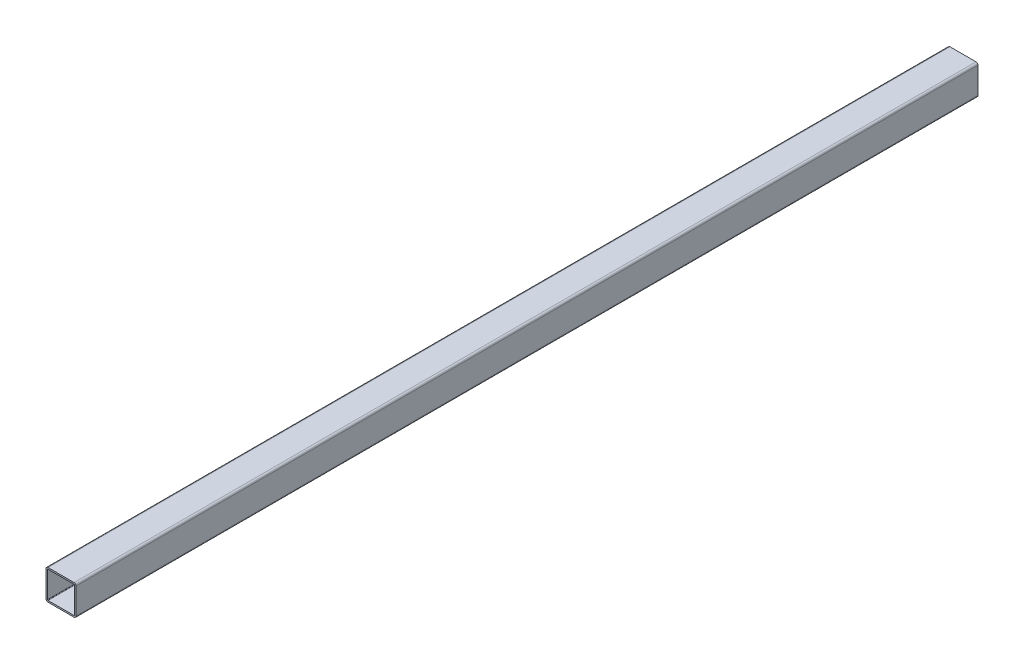
ISO-10303-21;
HEADER;
FILE_DESCRIPTION(('STEP AP214'),'2;1');
FILE_NAME('part.step','',(''),(''),'','','');
FILE_SCHEMA(('AUTOMOTIVE_DESIGN { 1 0 10303 214 1 1 1 1 }'));
ENDSEC;
DATA;
#1=APPLICATION_CONTEXT('core data for automotive mechanical design processes');
#2=APPLICATION_PROTOCOL_DEFINITION('international standard','automotive_design',2000,#1);
#3=PRODUCT_CONTEXT('',#1,'mechanical');
#4=PRODUCT('Part','Part','',(#3));
#5=PRODUCT_RELATED_PRODUCT_CATEGORY('part','',(#4));
#6=PRODUCT_DEFINITION_FORMATION('','',#4);
#7=PRODUCT_DEFINITION_CONTEXT('part definition',#1,'design');
#8=PRODUCT_DEFINITION('design','',#6,#7);
#9=PRODUCT_DEFINITION_SHAPE('','',#8);
#10=(LENGTH_UNIT() NAMED_UNIT(*) SI_UNIT(.MILLI.,.METRE.));
#11=(NAMED_UNIT(*) PLANE_ANGLE_UNIT() SI_UNIT($,.RADIAN.));
#12=(NAMED_UNIT(*) SI_UNIT($,.STERADIAN.) SOLID_ANGLE_UNIT());
#13=UNCERTAINTY_MEASURE_WITH_UNIT(LENGTH_MEASURE(1.E-05),#10,'distance_accuracy_value','');
#14=(GEOMETRIC_REPRESENTATION_CONTEXT(3) GLOBAL_UNCERTAINTY_ASSIGNED_CONTEXT((#13)) GLOBAL_UNIT_ASSIGNED_CONTEXT((#10,
#11,#12)) REPRESENTATION_CONTEXT('',''));
#15=CARTESIAN_POINT('',(0.,0.,0.));
#16=DIRECTION('',(0.,0.,1.));
#17=DIRECTION('',(1.,0.,0.));
#18=AXIS2_PLACEMENT_3D('',#15,#16,#17);
#19=CARTESIAN_POINT('',(2.,2.,900.));
#20=DIRECTION('',(0.,0.,1.));
#21=DIRECTION('',(1.,0.,0.));
#22=AXIS2_PLACEMENT_3D('',#19,#20,#21);
#23=PLANE('',#22);
#24=CARTESIAN_POINT('',(2.,2.,900.));
#25=DIRECTION('',(0.,0.,1.));
#26=DIRECTION('',(1.,0.,0.));
#27=AXIS2_PLACEMENT_3D('',#24,#25,#26);
#28=CIRCLE('',#27,2.);
#29=CARTESIAN_POINT('',(0.,2.00000000000001,900.));
#30=VERTEX_POINT('',#29);
#31=CARTESIAN_POINT('',(2.00000000000001,0.,900.));
#32=VERTEX_POINT('',#31);
#33=EDGE_CURVE('E260',#30,#32,#28,.T.);
#34=ORIENTED_EDGE('',*,*,#33,.T.);
#35=DIRECTION('',(1.,0.,0.));
#36=VECTOR('',#35,1.);
#37=CARTESIAN_POINT('',(2.00000000000001,0.,900.));
#38=LINE('',#37,#36);
#39=CARTESIAN_POINT('',(28.,0.,900.));
#40=VERTEX_POINT('',#39);
#41=EDGE_CURVE('E263',#32,#40,#38,.T.);
#42=ORIENTED_EDGE('',*,*,#41,.T.);
#43=CARTESIAN_POINT('',(28.,2.,900.));
#44=DIRECTION('',(0.,0.,1.));
#45=DIRECTION('',(-1.,0.,0.));
#46=AXIS2_PLACEMENT_3D('',#43,#44,#45);
#47=CIRCLE('',#46,2.);
#48=CARTESIAN_POINT('',(30.,2.00000000000001,900.));
#49=VERTEX_POINT('',#48);
#50=EDGE_CURVE('E266',#40,#49,#47,.T.);
#51=ORIENTED_EDGE('',*,*,#50,.T.);
#52=DIRECTION('',(0.,1.,0.));
#53=VECTOR('',#52,1.);
#54=CARTESIAN_POINT('',(30.,2.00000000000001,900.));
#55=LINE('',#54,#53);
#56=CARTESIAN_POINT('',(30.,28.,900.));
#57=VERTEX_POINT('',#56);
#58=EDGE_CURVE('E268',#49,#57,#55,.T.);
#59=ORIENTED_EDGE('',*,*,#58,.T.);
#60=CARTESIAN_POINT('',(28.,28.,900.));
#61=DIRECTION('',(0.,0.,1.));
#62=DIRECTION('',(-1.,0.,0.));
#63=AXIS2_PLACEMENT_3D('',#60,#61,#62);
#64=CIRCLE('',#63,2.);
#65=CARTESIAN_POINT('',(28.,30.,900.));
#66=VERTEX_POINT('',#65);
#67=EDGE_CURVE('E270',#57,#66,#64,.T.);
#68=ORIENTED_EDGE('',*,*,#67,.T.);
#69=DIRECTION('',(-1.,0.,0.));
#70=VECTOR('',#69,1.);
#71=CARTESIAN_POINT('',(2.00000000000001,30.,900.));
#72=LINE('',#71,#70);
#73=CARTESIAN_POINT('',(2.00000000000001,30.,900.));
#74=VERTEX_POINT('',#73);
#75=EDGE_CURVE('E272',#66,#74,#72,.T.);
#76=ORIENTED_EDGE('',*,*,#75,.T.);
#77=CARTESIAN_POINT('',(2.,28.,900.));
#78=DIRECTION('',(0.,0.,1.));
#79=DIRECTION('',(1.,0.,0.));
#80=AXIS2_PLACEMENT_3D('',#77,#78,#79);
#81=CIRCLE('',#80,2.);
#82=CARTESIAN_POINT('',(0.,28.,900.));
#83=VERTEX_POINT('',#82);
#84=EDGE_CURVE('E274',#74,#83,#81,.T.);
#85=ORIENTED_EDGE('',*,*,#84,.T.);
#86=DIRECTION('',(0.,-1.,0.));
#87=VECTOR('',#86,1.);
#88=CARTESIAN_POINT('',(0.,2.00000000000001,900.));
#89=LINE('',#88,#87);
#90=EDGE_CURVE('E276',#83,#30,#89,.T.);
#91=ORIENTED_EDGE('',*,*,#90,.T.);
#92=EDGE_LOOP('',(#34,#42,#51,#59,#68,#76,#85,#91));
#93=FACE_BOUND('',#92,.T.);
#94=DIRECTION('',(1.,0.,0.));
#95=VECTOR('',#94,1.);
#96=CARTESIAN_POINT('',(2.00000000000001,1.5,900.));
#97=LINE('',#96,#95);
#98=CARTESIAN_POINT('',(2.00000000000001,1.5,900.));
#99=VERTEX_POINT('',#98);
#100=CARTESIAN_POINT('',(28.,1.5,900.));
#101=VERTEX_POINT('',#100);
#102=EDGE_CURVE('E203',#99,#101,#97,.T.);
#103=ORIENTED_EDGE('',*,*,#102,.F.);
#104=CARTESIAN_POINT('',(2.,2.,900.));
#105=DIRECTION('',(0.,0.,1.));
#106=DIRECTION('',(1.,0.,0.));
#107=AXIS2_PLACEMENT_3D('',#104,#105,#106);
#108=CIRCLE('',#107,0.5);
#109=CARTESIAN_POINT('',(1.5,2.00000000000001,900.));
#110=VERTEX_POINT('',#109);
#111=EDGE_CURVE('E195',#110,#99,#108,.T.);
#112=ORIENTED_EDGE('',*,*,#111,.F.);
#113=DIRECTION('',(0.,-1.,0.));
#114=VECTOR('',#113,1.);
#115=CARTESIAN_POINT('',(1.5,2.00000000000001,900.));
#116=LINE('',#115,#114);
#117=CARTESIAN_POINT('',(1.5,28.,900.));
#118=VERTEX_POINT('',#117);
#119=EDGE_CURVE('E228',#118,#110,#116,.T.);
#120=ORIENTED_EDGE('',*,*,#119,.F.);
#121=CARTESIAN_POINT('',(2.,28.,900.));
#122=DIRECTION('',(0.,0.,1.));
#123=DIRECTION('',(1.,0.,0.));
#124=AXIS2_PLACEMENT_3D('',#121,#122,#123);
#125=CIRCLE('',#124,0.500000000000001);
#126=CARTESIAN_POINT('',(2.00000000000001,28.5,900.));
#127=VERTEX_POINT('',#126);
#128=EDGE_CURVE('E226',#127,#118,#125,.T.);
#129=ORIENTED_EDGE('',*,*,#128,.F.);
#130=DIRECTION('',(-1.,0.,0.));
#131=VECTOR('',#130,1.);
#132=CARTESIAN_POINT('',(2.00000000000001,28.5,900.));
#133=LINE('',#132,#131);
#134=CARTESIAN_POINT('',(28.,28.5,900.));
#135=VERTEX_POINT('',#134);
#136=EDGE_CURVE('E224',#135,#127,#133,.T.);
#137=ORIENTED_EDGE('',*,*,#136,.F.);
#138=CARTESIAN_POINT('',(28.,28.,900.));
#139=DIRECTION('',(0.,0.,1.));
#140=DIRECTION('',(1.,0.,0.));
#141=AXIS2_PLACEMENT_3D('',#138,#139,#140);
#142=CIRCLE('',#141,0.500000000000002);
#143=CARTESIAN_POINT('',(28.5,28.,900.));
#144=VERTEX_POINT('',#143);
#145=EDGE_CURVE('E222',#144,#135,#142,.T.);
#146=ORIENTED_EDGE('',*,*,#145,.F.);
#147=DIRECTION('',(0.,1.,0.));
#148=VECTOR('',#147,1.);
#149=CARTESIAN_POINT('',(28.5,2.00000000000001,900.));
#150=LINE('',#149,#148);
#151=CARTESIAN_POINT('',(28.5,2.,900.));
#152=VERTEX_POINT('',#151);
#153=EDGE_CURVE('E218',#152,#144,#150,.T.);
#154=ORIENTED_EDGE('',*,*,#153,.F.);
#155=CARTESIAN_POINT('',(28.,2.,900.));
#156=DIRECTION('',(0.,0.,1.));
#157=DIRECTION('',(1.,0.,0.));
#158=AXIS2_PLACEMENT_3D('',#155,#156,#157);
#159=CIRCLE('',#158,0.500000000000001);
#160=EDGE_CURVE('E216',#101,#152,#159,.T.);
#161=ORIENTED_EDGE('',*,*,#160,.F.);
#162=EDGE_LOOP('',(#103,#112,#120,#129,#137,#146,#154,#161));
#163=FACE_BOUND('',#162,.T.);
#164=ADVANCED_FACE('F82',(#93,#163),#23,.T.);
#165=CARTESIAN_POINT('',(2.,2.,0.));
#166=DIRECTION('',(0.,0.,1.));
#167=DIRECTION('',(1.,0.,0.));
#168=AXIS2_PLACEMENT_3D('',#165,#166,#167);
#169=PLANE('',#168);
#170=CARTESIAN_POINT('',(2.,2.,0.));
#171=DIRECTION('',(0.,0.,1.));
#172=DIRECTION('',(1.,0.,0.));
#173=AXIS2_PLACEMENT_3D('',#170,#171,#172);
#174=CIRCLE('',#173,2.);
#175=CARTESIAN_POINT('',(0.,2.00000000000001,0.));
#176=VERTEX_POINT('',#175);
#177=CARTESIAN_POINT('',(2.00000000000001,0.,0.));
#178=VERTEX_POINT('',#177);
#179=EDGE_CURVE('E211',#176,#178,#174,.T.);
#180=ORIENTED_EDGE('',*,*,#179,.F.);
#181=DIRECTION('',(0.,-1.,0.));
#182=VECTOR('',#181,1.);
#183=CARTESIAN_POINT('',(0.,2.00000000000001,0.));
#184=LINE('',#183,#182);
#185=CARTESIAN_POINT('',(0.,28.,0.));
#186=VERTEX_POINT('',#185);
#187=EDGE_CURVE('E264',#186,#176,#184,.T.);
#188=ORIENTED_EDGE('',*,*,#187,.F.);
#189=CARTESIAN_POINT('',(2.,28.,0.));
#190=DIRECTION('',(0.,0.,1.));
#191=DIRECTION('',(1.,0.,0.));
#192=AXIS2_PLACEMENT_3D('',#189,#190,#191);
#193=CIRCLE('',#192,2.);
#194=CARTESIAN_POINT('',(2.00000000000001,30.,0.));
#195=VERTEX_POINT('',#194);
#196=EDGE_CURVE('E291',#195,#186,#193,.T.);
#197=ORIENTED_EDGE('',*,*,#196,.F.);
#198=DIRECTION('',(-1.,0.,0.));
#199=VECTOR('',#198,1.);
#200=CARTESIAN_POINT('',(2.00000000000001,30.,0.));
#201=LINE('',#200,#199);
#202=CARTESIAN_POINT('',(28.,30.,0.));
#203=VERTEX_POINT('',#202);
#204=EDGE_CURVE('E289',#203,#195,#201,.T.);
#205=ORIENTED_EDGE('',*,*,#204,.F.);
#206=CARTESIAN_POINT('',(28.,28.,0.));
#207=DIRECTION('',(0.,0.,1.));
#208=DIRECTION('',(-1.,0.,0.));
#209=AXIS2_PLACEMENT_3D('',#206,#207,#208);
#210=CIRCLE('',#209,2.);
#211=CARTESIAN_POINT('',(30.,28.,0.));
#212=VERTEX_POINT('',#211);
#213=EDGE_CURVE('E287',#212,#203,#210,.T.);
#214=ORIENTED_EDGE('',*,*,#213,.F.);
#215=DIRECTION('',(0.,1.,0.));
#216=VECTOR('',#215,1.);
#217=CARTESIAN_POINT('',(30.,2.00000000000001,0.));
#218=LINE('',#217,#216);
#219=CARTESIAN_POINT('',(30.,2.00000000000001,0.));
#220=VERTEX_POINT('',#219);
#221=EDGE_CURVE('E285',#220,#212,#218,.T.);
#222=ORIENTED_EDGE('',*,*,#221,.F.);
#223=CARTESIAN_POINT('',(28.,2.,0.));
#224=DIRECTION('',(0.,0.,1.));
#225=DIRECTION('',(-1.,0.,0.));
#226=AXIS2_PLACEMENT_3D('',#223,#224,#225);
#227=CIRCLE('',#226,2.);
#228=CARTESIAN_POINT('',(28.,0.,0.));
#229=VERTEX_POINT('',#228);
#230=EDGE_CURVE('E283',#229,#220,#227,.T.);
#231=ORIENTED_EDGE('',*,*,#230,.F.);
#232=DIRECTION('',(1.,0.,0.));
#233=VECTOR('',#232,1.);
#234=CARTESIAN_POINT('',(2.00000000000001,0.,0.));
#235=LINE('',#234,#233);
#236=EDGE_CURVE('E281',#178,#229,#235,.T.);
#237=ORIENTED_EDGE('',*,*,#236,.F.);
#238=EDGE_LOOP('',(#180,#188,#197,#205,#214,#222,#231,#237));
#239=FACE_BOUND('',#238,.T.);
#240=CARTESIAN_POINT('',(2.,2.,0.));
#241=DIRECTION('',(0.,0.,1.));
#242=DIRECTION('',(1.,0.,0.));
#243=AXIS2_PLACEMENT_3D('',#240,#241,#242);
#244=CIRCLE('',#243,0.5);
#245=CARTESIAN_POINT('',(1.5,2.00000000000001,0.));
#246=VERTEX_POINT('',#245);
#247=CARTESIAN_POINT('',(2.00000000000001,1.5,0.));
#248=VERTEX_POINT('',#247);
#249=EDGE_CURVE('E105',#246,#248,#244,.T.);
#250=ORIENTED_EDGE('',*,*,#249,.T.);
#251=DIRECTION('',(1.,0.,0.));
#252=VECTOR('',#251,1.);
#253=CARTESIAN_POINT('',(2.00000000000001,1.5,0.));
#254=LINE('',#253,#252);
#255=CARTESIAN_POINT('',(28.,1.5,0.));
#256=VERTEX_POINT('',#255);
#257=EDGE_CURVE('E210',#248,#256,#254,.T.);
#258=ORIENTED_EDGE('',*,*,#257,.T.);
#259=CARTESIAN_POINT('',(28.,2.,0.));
#260=DIRECTION('',(0.,0.,1.));
#261=DIRECTION('',(1.,0.,0.));
#262=AXIS2_PLACEMENT_3D('',#259,#260,#261);
#263=CIRCLE('',#262,0.500000000000001);
#264=CARTESIAN_POINT('',(28.5,2.,0.));
#265=VERTEX_POINT('',#264);
#266=EDGE_CURVE('E232',#256,#265,#263,.T.);
#267=ORIENTED_EDGE('',*,*,#266,.T.);
#268=DIRECTION('',(0.,1.,0.));
#269=VECTOR('',#268,1.);
#270=CARTESIAN_POINT('',(28.5,2.00000000000001,0.));
#271=LINE('',#270,#269);
#272=CARTESIAN_POINT('',(28.5,28.,0.));
#273=VERTEX_POINT('',#272);
#274=EDGE_CURVE('E235',#265,#273,#271,.T.);
#275=ORIENTED_EDGE('',*,*,#274,.T.);
#276=CARTESIAN_POINT('',(28.,28.,0.));
#277=DIRECTION('',(0.,0.,1.));
#278=DIRECTION('',(1.,0.,0.));
#279=AXIS2_PLACEMENT_3D('',#276,#277,#278);
#280=CIRCLE('',#279,0.500000000000002);
#281=CARTESIAN_POINT('',(28.,28.5,0.));
#282=VERTEX_POINT('',#281);
#283=EDGE_CURVE('E238',#273,#282,#280,.T.);
#284=ORIENTED_EDGE('',*,*,#283,.T.);
#285=DIRECTION('',(-1.,0.,0.));
#286=VECTOR('',#285,1.);
#287=CARTESIAN_POINT('',(2.00000000000001,28.5,0.));
#288=LINE('',#287,#286);
#289=CARTESIAN_POINT('',(2.00000000000001,28.5,0.));
#290=VERTEX_POINT('',#289);
#291=EDGE_CURVE('E241',#282,#290,#288,.T.);
#292=ORIENTED_EDGE('',*,*,#291,.T.);
#293=CARTESIAN_POINT('',(2.,28.,0.));
#294=DIRECTION('',(0.,0.,1.));
#295=DIRECTION('',(1.,0.,0.));
#296=AXIS2_PLACEMENT_3D('',#293,#294,#295);
#297=CIRCLE('',#296,0.500000000000001);
#298=CARTESIAN_POINT('',(1.5,28.,0.));
#299=VERTEX_POINT('',#298);
#300=EDGE_CURVE('E244',#290,#299,#297,.T.);
#301=ORIENTED_EDGE('',*,*,#300,.T.);
#302=DIRECTION('',(0.,-1.,0.));
#303=VECTOR('',#302,1.);
#304=CARTESIAN_POINT('',(1.5,2.00000000000001,0.));
#305=LINE('',#304,#303);
#306=EDGE_CURVE('E204',#299,#246,#305,.T.);
#307=ORIENTED_EDGE('',*,*,#306,.T.);
#308=EDGE_LOOP('',(#250,#258,#267,#275,#284,#292,#301,#307));
#309=FACE_BOUND('',#308,.T.);
#310=ADVANCED_FACE('F321',(#239,#309),#169,.F.);
#311=CARTESIAN_POINT('',(2.,2.,900.));
#312=DIRECTION('',(0.,0.,-1.));
#313=DIRECTION('',(-1.,0.,0.));
#314=AXIS2_PLACEMENT_3D('',#311,#312,#313);
#315=CYLINDRICAL_SURFACE('',#314,2.);
#316=ORIENTED_EDGE('',*,*,#179,.T.);
#317=DIRECTION('',(0.,0.,-1.));
#318=VECTOR('',#317,1.);
#319=CARTESIAN_POINT('',(2.00000000000001,0.,900.));
#320=LINE('',#319,#318);
#321=EDGE_CURVE('E12',#32,#178,#320,.T.);
#322=ORIENTED_EDGE('',*,*,#321,.F.);
#323=ORIENTED_EDGE('',*,*,#33,.F.);
#324=DIRECTION('',(0.,0.,-1.));
#325=VECTOR('',#324,1.);
#326=CARTESIAN_POINT('',(0.,2.00000000000001,900.));
#327=LINE('',#326,#325);
#328=EDGE_CURVE('E278',#30,#176,#327,.T.);
#329=ORIENTED_EDGE('',*,*,#328,.T.);
#330=EDGE_LOOP('',(#316,#322,#323,#329));
#331=FACE_BOUND('',#330,.T.);
#332=ADVANCED_FACE('F84',(#331),#315,.T.);
#333=CARTESIAN_POINT('',(2.00000000000001,0.,900.));
#334=DIRECTION('',(0.,1.,0.));
#335=DIRECTION('',(0.,0.,1.));
#336=AXIS2_PLACEMENT_3D('',#333,#334,#335);
#337=PLANE('',#336);
#338=ORIENTED_EDGE('',*,*,#236,.T.);
#339=DIRECTION('',(0.,0.,-1.));
#340=VECTOR('',#339,1.);
#341=CARTESIAN_POINT('',(28.,0.,900.));
#342=LINE('',#341,#340);
#343=EDGE_CURVE('E90',#40,#229,#342,.T.);
#344=ORIENTED_EDGE('',*,*,#343,.F.);
#345=ORIENTED_EDGE('',*,*,#41,.F.);
#346=ORIENTED_EDGE('',*,*,#321,.T.);
#347=EDGE_LOOP('',(#338,#344,#345,#346));
#348=FACE_BOUND('',#347,.T.);
#349=ADVANCED_FACE('F338',(#348),#337,.F.);
#350=CARTESIAN_POINT('',(28.,2.,900.));
#351=DIRECTION('',(0.,0.,-1.));
#352=DIRECTION('',(-1.,0.,0.));
#353=AXIS2_PLACEMENT_3D('',#350,#351,#352);
#354=CYLINDRICAL_SURFACE('',#353,2.);
#355=ORIENTED_EDGE('',*,*,#230,.T.);
#356=DIRECTION('',(0.,0.,-1.));
#357=VECTOR('',#356,1.);
#358=CARTESIAN_POINT('',(30.,2.00000000000001,900.));
#359=LINE('',#358,#357);
#360=EDGE_CURVE('E308',#49,#220,#359,.T.);
#361=ORIENTED_EDGE('',*,*,#360,.F.);
#362=ORIENTED_EDGE('',*,*,#50,.F.);
#363=ORIENTED_EDGE('',*,*,#343,.T.);
#364=EDGE_LOOP('',(#355,#361,#362,#363));
#365=FACE_BOUND('',#364,.T.);
#366=ADVANCED_FACE('F315',(#365),#354,.T.);
#367=CARTESIAN_POINT('',(30.,2.00000000000001,900.));
#368=DIRECTION('',(-1.,0.,0.));
#369=DIRECTION('',(0.,0.,1.));
#370=AXIS2_PLACEMENT_3D('',#367,#368,#369);
#371=PLANE('',#370);
#372=ORIENTED_EDGE('',*,*,#221,.T.);
#373=DIRECTION('',(0.,0.,-1.));
#374=VECTOR('',#373,1.);
#375=CARTESIAN_POINT('',(30.,28.,900.));
#376=LINE('',#375,#374);
#377=EDGE_CURVE('E305',#57,#212,#376,.T.);
#378=ORIENTED_EDGE('',*,*,#377,.F.);
#379=ORIENTED_EDGE('',*,*,#58,.F.);
#380=ORIENTED_EDGE('',*,*,#360,.T.);
#381=EDGE_LOOP('',(#372,#378,#379,#380));
#382=FACE_BOUND('',#381,.T.);
#383=ADVANCED_FACE('F327',(#382),#371,.F.);
#384=CARTESIAN_POINT('',(28.,28.,900.));
#385=DIRECTION('',(0.,0.,-1.));
#386=DIRECTION('',(-1.,0.,0.));
#387=AXIS2_PLACEMENT_3D('',#384,#385,#386);
#388=CYLINDRICAL_SURFACE('',#387,2.);
#389=ORIENTED_EDGE('',*,*,#213,.T.);
#390=DIRECTION('',(0.,0.,-1.));
#391=VECTOR('',#390,1.);
#392=CARTESIAN_POINT('',(28.,30.,900.));
#393=LINE('',#392,#391);
#394=EDGE_CURVE('E302',#66,#203,#393,.T.);
#395=ORIENTED_EDGE('',*,*,#394,.F.);
#396=ORIENTED_EDGE('',*,*,#67,.F.);
#397=ORIENTED_EDGE('',*,*,#377,.T.);
#398=EDGE_LOOP('',(#389,#395,#396,#397));
#399=FACE_BOUND('',#398,.T.);
#400=ADVANCED_FACE('F331',(#399),#388,.T.);
#401=CARTESIAN_POINT('',(2.00000000000001,30.,900.));
#402=DIRECTION('',(0.,-1.,0.));
#403=DIRECTION('',(0.,0.,-1.));
#404=AXIS2_PLACEMENT_3D('',#401,#402,#403);
#405=PLANE('',#404);
#406=ORIENTED_EDGE('',*,*,#204,.T.);
#407=DIRECTION('',(0.,0.,-1.));
#408=VECTOR('',#407,1.);
#409=CARTESIAN_POINT('',(2.00000000000001,30.,900.));
#410=LINE('',#409,#408);
#411=EDGE_CURVE('E299',#74,#195,#410,.T.);
#412=ORIENTED_EDGE('',*,*,#411,.F.);
#413=ORIENTED_EDGE('',*,*,#75,.F.);
#414=ORIENTED_EDGE('',*,*,#394,.T.);
#415=EDGE_LOOP('',(#406,#412,#413,#414));
#416=FACE_BOUND('',#415,.T.);
#417=ADVANCED_FACE('F351',(#416),#405,.F.);
#418=CARTESIAN_POINT('',(2.,28.,900.));
#419=DIRECTION('',(0.,0.,-1.));
#420=DIRECTION('',(-1.,0.,0.));
#421=AXIS2_PLACEMENT_3D('',#418,#419,#420);
#422=CYLINDRICAL_SURFACE('',#421,2.);
#423=ORIENTED_EDGE('',*,*,#196,.T.);
#424=DIRECTION('',(0.,0.,-1.));
#425=VECTOR('',#424,1.);
#426=CARTESIAN_POINT('',(0.,28.,900.));
#427=LINE('',#426,#425);
#428=EDGE_CURVE('E296',#83,#186,#427,.T.);
#429=ORIENTED_EDGE('',*,*,#428,.F.);
#430=ORIENTED_EDGE('',*,*,#84,.F.);
#431=ORIENTED_EDGE('',*,*,#411,.T.);
#432=EDGE_LOOP('',(#423,#429,#430,#431));
#433=FACE_BOUND('',#432,.T.);
#434=ADVANCED_FACE('F349',(#433),#422,.T.);
#435=CARTESIAN_POINT('',(0.,2.00000000000001,900.));
#436=DIRECTION('',(1.,0.,0.));
#437=DIRECTION('',(0.,0.,-1.));
#438=AXIS2_PLACEMENT_3D('',#435,#436,#437);
#439=PLANE('',#438);
#440=ORIENTED_EDGE('',*,*,#187,.T.);
#441=ORIENTED_EDGE('',*,*,#328,.F.);
#442=ORIENTED_EDGE('',*,*,#90,.F.);
#443=ORIENTED_EDGE('',*,*,#428,.T.);
#444=EDGE_LOOP('',(#440,#441,#442,#443));
#445=FACE_BOUND('',#444,.T.);
#446=ADVANCED_FACE('F344',(#445),#439,.F.);
#447=CARTESIAN_POINT('',(2.,2.,900.));
#448=DIRECTION('',(0.,0.,-1.));
#449=DIRECTION('',(-1.,0.,0.));
#450=AXIS2_PLACEMENT_3D('',#447,#448,#449);
#451=CYLINDRICAL_SURFACE('',#450,0.5);
#452=ORIENTED_EDGE('',*,*,#249,.F.);
#453=DIRECTION('',(0.,0.,-1.));
#454=VECTOR('',#453,1.);
#455=CARTESIAN_POINT('',(1.5,2.00000000000001,900.));
#456=LINE('',#455,#454);
#457=EDGE_CURVE('E199',#110,#246,#456,.T.);
#458=ORIENTED_EDGE('',*,*,#457,.F.);
#459=ORIENTED_EDGE('',*,*,#111,.T.);
#460=DIRECTION('',(0.,0.,-1.));
#461=VECTOR('',#460,1.);
#462=CARTESIAN_POINT('',(2.00000000000001,1.5,900.));
#463=LINE('',#462,#461);
#464=EDGE_CURVE('E198',#99,#248,#463,.T.);
#465=ORIENTED_EDGE('',*,*,#464,.T.);
#466=EDGE_LOOP('',(#452,#458,#459,#465));
#467=FACE_BOUND('',#466,.T.);
#468=ADVANCED_FACE('F197',(#467),#451,.F.);
#469=CARTESIAN_POINT('',(2.00000000000001,1.5,900.));
#470=DIRECTION('',(0.,1.,0.));
#471=DIRECTION('',(0.,0.,1.));
#472=AXIS2_PLACEMENT_3D('',#469,#470,#471);
#473=PLANE('',#472);
#474=ORIENTED_EDGE('',*,*,#257,.F.);
#475=ORIENTED_EDGE('',*,*,#464,.F.);
#476=ORIENTED_EDGE('',*,*,#102,.T.);
#477=DIRECTION('',(0.,0.,-1.));
#478=VECTOR('',#477,1.);
#479=CARTESIAN_POINT('',(28.,1.5,900.));
#480=LINE('',#479,#478);
#481=EDGE_CURVE('E212',#101,#256,#480,.T.);
#482=ORIENTED_EDGE('',*,*,#481,.T.);
#483=EDGE_LOOP('',(#474,#475,#476,#482));
#484=FACE_BOUND('',#483,.T.);
#485=ADVANCED_FACE('F207',(#484),#473,.T.);
#486=CARTESIAN_POINT('',(28.,2.,900.));
#487=DIRECTION('',(0.,0.,-1.));
#488=DIRECTION('',(-1.,0.,0.));
#489=AXIS2_PLACEMENT_3D('',#486,#487,#488);
#490=CYLINDRICAL_SURFACE('',#489,0.500000000000001);
#491=ORIENTED_EDGE('',*,*,#266,.F.);
#492=ORIENTED_EDGE('',*,*,#481,.F.);
#493=ORIENTED_EDGE('',*,*,#160,.T.);
#494=DIRECTION('',(0.,0.,-1.));
#495=VECTOR('',#494,1.);
#496=CARTESIAN_POINT('',(28.5,2.,900.));
#497=LINE('',#496,#495);
#498=EDGE_CURVE('E257',#152,#265,#497,.T.);
#499=ORIENTED_EDGE('',*,*,#498,.T.);
#500=EDGE_LOOP('',(#491,#492,#493,#499));
#501=FACE_BOUND('',#500,.T.);
#502=ADVANCED_FACE('F376',(#501),#490,.F.);
#503=CARTESIAN_POINT('',(28.5,2.00000000000001,900.));
#504=DIRECTION('',(-1.,0.,0.));
#505=DIRECTION('',(0.,0.,1.));
#506=AXIS2_PLACEMENT_3D('',#503,#504,#505);
#507=PLANE('',#506);
#508=ORIENTED_EDGE('',*,*,#274,.F.);
#509=ORIENTED_EDGE('',*,*,#498,.F.);
#510=ORIENTED_EDGE('',*,*,#153,.T.);
#511=DIRECTION('',(0.,0.,-1.));
#512=VECTOR('',#511,1.);
#513=CARTESIAN_POINT('',(28.5,28.,900.));
#514=LINE('',#513,#512);
#515=EDGE_CURVE('E255',#144,#273,#514,.T.);
#516=ORIENTED_EDGE('',*,*,#515,.T.);
#517=EDGE_LOOP('',(#508,#509,#510,#516));
#518=FACE_BOUND('',#517,.T.);
#519=ADVANCED_FACE('F380',(#518),#507,.T.);
#520=CARTESIAN_POINT('',(28.,28.,900.));
#521=DIRECTION('',(0.,0.,-1.));
#522=DIRECTION('',(-1.,0.,0.));
#523=AXIS2_PLACEMENT_3D('',#520,#521,#522);
#524=CYLINDRICAL_SURFACE('',#523,0.500000000000002);
#525=ORIENTED_EDGE('',*,*,#283,.F.);
#526=ORIENTED_EDGE('',*,*,#515,.F.);
#527=ORIENTED_EDGE('',*,*,#145,.T.);
#528=DIRECTION('',(0.,0.,-1.));
#529=VECTOR('',#528,1.);
#530=CARTESIAN_POINT('',(28.,28.5,900.));
#531=LINE('',#530,#529);
#532=EDGE_CURVE('E253',#135,#282,#531,.T.);
#533=ORIENTED_EDGE('',*,*,#532,.T.);
#534=EDGE_LOOP('',(#525,#526,#527,#533));
#535=FACE_BOUND('',#534,.T.);
#536=ADVANCED_FACE('F386',(#535),#524,.F.);
#537=CARTESIAN_POINT('',(2.00000000000001,28.5,900.));
#538=DIRECTION('',(0.,-1.,0.));
#539=DIRECTION('',(0.,0.,-1.));
#540=AXIS2_PLACEMENT_3D('',#537,#538,#539);
#541=PLANE('',#540);
#542=ORIENTED_EDGE('',*,*,#291,.F.);
#543=ORIENTED_EDGE('',*,*,#532,.F.);
#544=ORIENTED_EDGE('',*,*,#136,.T.);
#545=DIRECTION('',(0.,0.,-1.));
#546=VECTOR('',#545,1.);
#547=CARTESIAN_POINT('',(2.00000000000001,28.5,900.));
#548=LINE('',#547,#546);
#549=EDGE_CURVE('E251',#127,#290,#548,.T.);
#550=ORIENTED_EDGE('',*,*,#549,.T.);
#551=EDGE_LOOP('',(#542,#543,#544,#550));
#552=FACE_BOUND('',#551,.T.);
#553=ADVANCED_FACE('F390',(#552),#541,.T.);
#554=CARTESIAN_POINT('',(2.,28.,900.));
#555=DIRECTION('',(0.,0.,-1.));
#556=DIRECTION('',(-1.,0.,0.));
#557=AXIS2_PLACEMENT_3D('',#554,#555,#556);
#558=CYLINDRICAL_SURFACE('',#557,0.500000000000001);
#559=ORIENTED_EDGE('',*,*,#300,.F.);
#560=ORIENTED_EDGE('',*,*,#549,.F.);
#561=ORIENTED_EDGE('',*,*,#128,.T.);
#562=DIRECTION('',(0.,0.,-1.));
#563=VECTOR('',#562,1.);
#564=CARTESIAN_POINT('',(1.5,28.,900.));
#565=LINE('',#564,#563);
#566=EDGE_CURVE('E97',#118,#299,#565,.T.);
#567=ORIENTED_EDGE('',*,*,#566,.T.);
#568=EDGE_LOOP('',(#559,#560,#561,#567));
#569=FACE_BOUND('',#568,.T.);
#570=ADVANCED_FACE('F394',(#569),#558,.F.);
#571=CARTESIAN_POINT('',(1.5,2.00000000000001,900.));
#572=DIRECTION('',(1.,0.,0.));
#573=DIRECTION('',(0.,0.,-1.));
#574=AXIS2_PLACEMENT_3D('',#571,#572,#573);
#575=PLANE('',#574);
#576=ORIENTED_EDGE('',*,*,#306,.F.);
#577=ORIENTED_EDGE('',*,*,#566,.F.);
#578=ORIENTED_EDGE('',*,*,#119,.T.);
#579=ORIENTED_EDGE('',*,*,#457,.T.);
#580=EDGE_LOOP('',(#576,#577,#578,#579));
#581=FACE_BOUND('',#580,.T.);
#582=ADVANCED_FACE('F398',(#581),#575,.T.);
#583=CLOSED_SHELL('',(#164,#310,#332,#349,#366,#383,#400,#417,#434,#446,#468,#485,#502,#519,
#536,#553,#570,#582));
#584=MANIFOLD_SOLID_BREP('B2',#583);
#585=ADVANCED_BREP_SHAPE_REPRESENTATION('',(#18,#584),#14);
#586=SHAPE_DEFINITION_REPRESENTATION(#9,#585);
ENDSEC;
END-ISO-10303-21;
